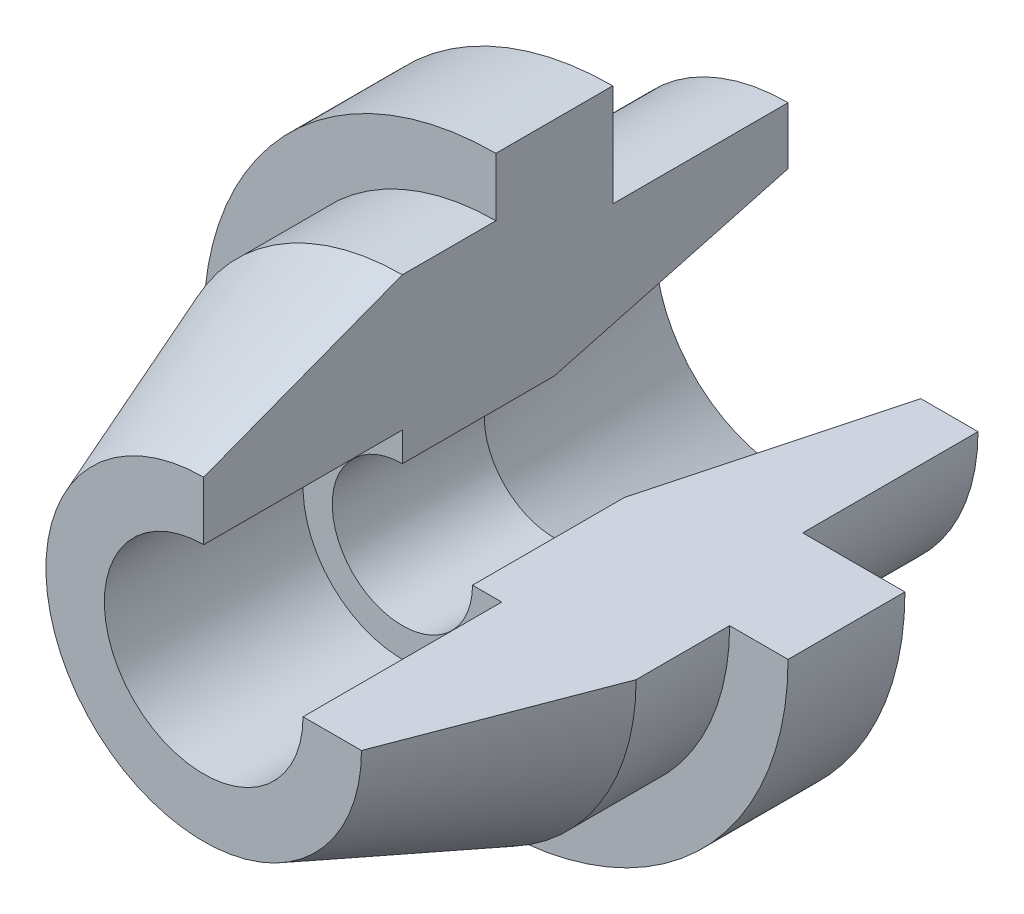
ISO-10303-21;
HEADER;
FILE_DESCRIPTION(('STEP AP214'),'2;1');
FILE_NAME('part.step','',(''),(''),'','','');
FILE_SCHEMA(('AUTOMOTIVE_DESIGN { 1 0 10303 214 1 1 1 1 }'));
ENDSEC;
DATA;
#1=APPLICATION_CONTEXT('core data for automotive mechanical design processes');
#2=APPLICATION_PROTOCOL_DEFINITION('international standard','automotive_design',2000,#1);
#3=PRODUCT_CONTEXT('',#1,'mechanical');
#4=PRODUCT('Part','Part','',(#3));
#5=PRODUCT_RELATED_PRODUCT_CATEGORY('part','',(#4));
#6=PRODUCT_DEFINITION_FORMATION('','',#4);
#7=PRODUCT_DEFINITION_CONTEXT('part definition',#1,'design');
#8=PRODUCT_DEFINITION('design','',#6,#7);
#9=PRODUCT_DEFINITION_SHAPE('','',#8);
#10=(LENGTH_UNIT() NAMED_UNIT(*) SI_UNIT(.MILLI.,.METRE.));
#11=(NAMED_UNIT(*) PLANE_ANGLE_UNIT() SI_UNIT($,.RADIAN.));
#12=(NAMED_UNIT(*) SI_UNIT($,.STERADIAN.) SOLID_ANGLE_UNIT());
#13=UNCERTAINTY_MEASURE_WITH_UNIT(LENGTH_MEASURE(1.E-05),#10,'distance_accuracy_value','');
#14=(GEOMETRIC_REPRESENTATION_CONTEXT(3) GLOBAL_UNCERTAINTY_ASSIGNED_CONTEXT((#13)) GLOBAL_UNIT_ASSIGNED_CONTEXT((#10,
#11,#12)) REPRESENTATION_CONTEXT('',''));
#15=CARTESIAN_POINT('',(0.,0.,0.));
#16=DIRECTION('',(0.,0.,1.));
#17=DIRECTION('',(1.,0.,0.));
#18=AXIS2_PLACEMENT_3D('',#15,#16,#17);
#19=CARTESIAN_POINT('',(0.,0.,0.));
#20=DIRECTION('',(0.,1.,0.));
#21=DIRECTION('',(0.,0.,1.));
#22=AXIS2_PLACEMENT_3D('',#19,#20,#21);
#23=PLANE('',#22);
#24=DIRECTION('',(1.,0.,0.));
#25=VECTOR('',#24,1.);
#26=CARTESIAN_POINT('',(0.,0.,-34.));
#27=LINE('',#26,#25);
#28=CARTESIAN_POINT('',(11.9999999999999,1.25693328198352E-13,-34.));
#29=VERTEX_POINT('',#28);
#30=CARTESIAN_POINT('',(16.9999999999999,1.78065548280999E-13,-34.0000000000001));
#31=VERTEX_POINT('',#30);
#32=EDGE_CURVE('E150',#29,#31,#27,.T.);
#33=ORIENTED_EDGE('',*,*,#32,.T.);
#34=DIRECTION('',(0.,0.,1.));
#35=VECTOR('',#34,1.);
#36=CARTESIAN_POINT('',(16.9999999999999,1.78065548280999E-13,0.));
#37=LINE('',#36,#35);
#38=CARTESIAN_POINT('',(17.,1.78065548281E-13,0.));
#39=VERTEX_POINT('',#38);
#40=EDGE_CURVE('E135',#31,#39,#37,.T.);
#41=ORIENTED_EDGE('',*,*,#40,.T.);
#42=DIRECTION('',(-1.,0.,0.));
#43=VECTOR('',#42,1.);
#44=CARTESIAN_POINT('',(0.,0.,0.));
#45=LINE('',#44,#43);
#46=CARTESIAN_POINT('',(27.,2.82809988446294E-13,0.));
#47=VERTEX_POINT('',#46);
#48=EDGE_CURVE('E225',#47,#39,#45,.T.);
#49=ORIENTED_EDGE('',*,*,#48,.F.);
#50=DIRECTION('',(-0.357137466266591,0.,0.934051834851085));
#51=VECTOR('',#50,1.);
#52=CARTESIAN_POINT('',(27.,2.82809988446294E-13,0.));
#53=LINE('',#52,#51);
#54=CARTESIAN_POINT('',(40.,4.18977760661176E-13,-34.));
#55=VERTEX_POINT('',#54);
#56=EDGE_CURVE('E222',#55,#47,#53,.T.);
#57=ORIENTED_EDGE('',*,*,#56,.F.);
#58=DIRECTION('',(0.,0.,1.));
#59=VECTOR('',#58,1.);
#60=CARTESIAN_POINT('',(40.,4.18977760661176E-13,-34.));
#61=LINE('',#60,#59);
#62=CARTESIAN_POINT('',(40.,4.18977760661176E-13,-50.));
#63=VERTEX_POINT('',#62);
#64=EDGE_CURVE('E218',#63,#55,#61,.T.);
#65=ORIENTED_EDGE('',*,*,#64,.F.);
#66=DIRECTION('',(-1.,0.,0.));
#67=VECTOR('',#66,1.);
#68=CARTESIAN_POINT('',(40.,4.18977760661176E-13,-50.));
#69=LINE('',#68,#67);
#70=CARTESIAN_POINT('',(50.,5.2372220082647E-13,-50.));
#71=VERTEX_POINT('',#70);
#72=EDGE_CURVE('E214',#71,#63,#69,.T.);
#73=ORIENTED_EDGE('',*,*,#72,.F.);
#74=DIRECTION('',(0.,0.,1.));
#75=VECTOR('',#74,1.);
#76=CARTESIAN_POINT('',(50.,5.2372220082647E-13,-50.));
#77=LINE('',#76,#75);
#78=CARTESIAN_POINT('',(50.,5.2372220082647E-13,-70.));
#79=VERTEX_POINT('',#78);
#80=EDGE_CURVE('E210',#79,#71,#77,.T.);
#81=ORIENTED_EDGE('',*,*,#80,.F.);
#82=DIRECTION('',(1.,0.,0.));
#83=VECTOR('',#82,1.);
#84=CARTESIAN_POINT('',(50.,5.2372220082647E-13,-70.));
#85=LINE('',#84,#83);
#86=CARTESIAN_POINT('',(32.5,3.40419430537206E-13,-70.));
#87=VERTEX_POINT('',#86);
#88=EDGE_CURVE('E206',#87,#79,#85,.T.);
#89=ORIENTED_EDGE('',*,*,#88,.F.);
#90=DIRECTION('',(0.,0.,1.));
#91=VECTOR('',#90,1.);
#92=CARTESIAN_POINT('',(32.5,3.40419430537206E-13,-70.));
#93=LINE('',#92,#91);
#94=CARTESIAN_POINT('',(32.5,3.40419430537206E-13,-100.));
#95=VERTEX_POINT('',#94);
#96=EDGE_CURVE('E202',#95,#87,#93,.T.);
#97=ORIENTED_EDGE('',*,*,#96,.F.);
#98=DIRECTION('',(1.,0.,0.));
#99=VECTOR('',#98,1.);
#100=CARTESIAN_POINT('',(32.5,3.40419430537206E-13,-100.));
#101=LINE('',#100,#99);
#102=CARTESIAN_POINT('',(22.7179676972443,2.37958080814109E-13,-100.));
#103=VERTEX_POINT('',#102);
#104=EDGE_CURVE('E199',#103,#95,#101,.T.);
#105=ORIENTED_EDGE('',*,*,#104,.F.);
#106=DIRECTION('',(0.258819045102511,0.,-0.965925826289071));
#107=VECTOR('',#106,1.);
#108=CARTESIAN_POINT('',(0.,0.,-15.2153903091725));
#109=LINE('',#108,#107);
#110=CARTESIAN_POINT('',(11.9999999999998,2.85690460550838E-13,-60.));
#111=VERTEX_POINT('',#110);
#112=EDGE_CURVE('E147',#103,#111,#109,.F.);
#113=ORIENTED_EDGE('',*,*,#112,.T.);
#114=DIRECTION('',(0.,0.,1.));
#115=VECTOR('',#114,1.);
#116=CARTESIAN_POINT('',(11.9999999999998,1.25693328198351E-13,0.));
#117=LINE('',#116,#115);
#118=EDGE_CURVE('E157',#111,#29,#117,.T.);
#119=ORIENTED_EDGE('',*,*,#118,.T.);
#120=EDGE_LOOP('',(#33,#41,#49,#57,#65,#73,#81,#89,#97,#105,#113,#119));
#121=FACE_BOUND('',#120,.T.);
#122=ADVANCED_FACE('F45',(#121),#23,.T.);
#123=CARTESIAN_POINT('',(0.,0.,0.));
#124=DIRECTION('',(-1.,0.,0.));
#125=DIRECTION('',(0.,0.,1.));
#126=AXIS2_PLACEMENT_3D('',#123,#124,#125);
#127=PLANE('',#126);
#128=DIRECTION('',(0.,0.,1.));
#129=VECTOR('',#128,1.);
#130=CARTESIAN_POINT('',(0.,16.9999999999999,0.));
#131=LINE('',#130,#129);
#132=CARTESIAN_POINT('',(0.,17.,-34.));
#133=VERTEX_POINT('',#132);
#134=CARTESIAN_POINT('',(0.,17.,0.));
#135=VERTEX_POINT('',#134);
#136=EDGE_CURVE('E11',#133,#135,#131,.T.);
#137=ORIENTED_EDGE('',*,*,#136,.F.);
#138=DIRECTION('',(0.,1.,0.));
#139=VECTOR('',#138,1.);
#140=CARTESIAN_POINT('',(0.,1.1574260638265E-13,-34.));
#141=LINE('',#140,#139);
#142=CARTESIAN_POINT('',(0.,12.,-34.));
#143=VERTEX_POINT('',#142);
#144=EDGE_CURVE('E152',#143,#133,#141,.T.);
#145=ORIENTED_EDGE('',*,*,#144,.F.);
#146=DIRECTION('',(0.,0.,1.));
#147=VECTOR('',#146,1.);
#148=CARTESIAN_POINT('',(0.,11.9999999999998,0.));
#149=LINE('',#148,#147);
#150=CARTESIAN_POINT('',(0.,12.,-60.));
#151=VERTEX_POINT('',#150);
#152=EDGE_CURVE('E251',#151,#143,#149,.T.);
#153=ORIENTED_EDGE('',*,*,#152,.F.);
#154=DIRECTION('',(0.,0.258819045102514,-0.96592582628907));
#155=VECTOR('',#154,1.);
#156=CARTESIAN_POINT('',(0.,0.,-15.2153903091725));
#157=LINE('',#156,#155);
#158=CARTESIAN_POINT('',(0.,22.7179676972446,-100.));
#159=VERTEX_POINT('',#158);
#160=EDGE_CURVE('E54',#159,#151,#157,.F.);
#161=ORIENTED_EDGE('',*,*,#160,.F.);
#162=DIRECTION('',(0.,1.,0.));
#163=VECTOR('',#162,1.);
#164=CARTESIAN_POINT('',(0.,32.5,-100.));
#165=LINE('',#164,#163);
#166=CARTESIAN_POINT('',(0.,32.5,-100.));
#167=VERTEX_POINT('',#166);
#168=EDGE_CURVE('E146',#159,#167,#165,.T.);
#169=ORIENTED_EDGE('',*,*,#168,.T.);
#170=DIRECTION('',(0.,0.,1.));
#171=VECTOR('',#170,1.);
#172=CARTESIAN_POINT('',(0.,32.5,-70.));
#173=LINE('',#172,#171);
#174=CARTESIAN_POINT('',(0.,32.5,-70.));
#175=VERTEX_POINT('',#174);
#176=EDGE_CURVE('E171',#167,#175,#173,.T.);
#177=ORIENTED_EDGE('',*,*,#176,.T.);
#178=DIRECTION('',(0.,1.,0.));
#179=VECTOR('',#178,1.);
#180=CARTESIAN_POINT('',(0.,50.,-70.));
#181=LINE('',#180,#179);
#182=CARTESIAN_POINT('',(0.,50.,-70.));
#183=VERTEX_POINT('',#182);
#184=EDGE_CURVE('E175',#175,#183,#181,.T.);
#185=ORIENTED_EDGE('',*,*,#184,.T.);
#186=DIRECTION('',(0.,0.,1.));
#187=VECTOR('',#186,1.);
#188=CARTESIAN_POINT('',(0.,50.,-50.));
#189=LINE('',#188,#187);
#190=CARTESIAN_POINT('',(0.,50.,-50.));
#191=VERTEX_POINT('',#190);
#192=EDGE_CURVE('E179',#183,#191,#189,.T.);
#193=ORIENTED_EDGE('',*,*,#192,.T.);
#194=DIRECTION('',(0.,-1.,0.));
#195=VECTOR('',#194,1.);
#196=CARTESIAN_POINT('',(0.,40.,-50.));
#197=LINE('',#196,#195);
#198=CARTESIAN_POINT('',(0.,40.,-50.));
#199=VERTEX_POINT('',#198);
#200=EDGE_CURVE('E183',#191,#199,#197,.T.);
#201=ORIENTED_EDGE('',*,*,#200,.T.);
#202=DIRECTION('',(0.,0.,1.));
#203=VECTOR('',#202,1.);
#204=CARTESIAN_POINT('',(0.,40.,-34.));
#205=LINE('',#204,#203);
#206=CARTESIAN_POINT('',(0.,40.,-34.));
#207=VERTEX_POINT('',#206);
#208=EDGE_CURVE('E187',#199,#207,#205,.T.);
#209=ORIENTED_EDGE('',*,*,#208,.T.);
#210=DIRECTION('',(0.,-0.357137466266591,0.934051834851085));
#211=VECTOR('',#210,1.);
#212=CARTESIAN_POINT('',(0.,27.,0.));
#213=LINE('',#212,#211);
#214=CARTESIAN_POINT('',(0.,27.,0.));
#215=VERTEX_POINT('',#214);
#216=EDGE_CURVE('E191',#207,#215,#213,.T.);
#217=ORIENTED_EDGE('',*,*,#216,.T.);
#218=DIRECTION('',(0.,-1.,0.));
#219=VECTOR('',#218,1.);
#220=CARTESIAN_POINT('',(0.,0.,0.));
#221=LINE('',#220,#219);
#222=EDGE_CURVE('E195',#215,#135,#221,.T.);
#223=ORIENTED_EDGE('',*,*,#222,.T.);
#224=EDGE_LOOP('',(#137,#145,#153,#161,#169,#177,#185,#193,#201,#209,#217,#223));
#225=FACE_BOUND('',#224,.T.);
#226=ADVANCED_FACE('F268',(#225),#127,.F.);
#227=CARTESIAN_POINT('',(0.,0.,0.));
#228=DIRECTION('',(0.,0.,1.));
#229=DIRECTION('',(1.,0.,0.));
#230=AXIS2_PLACEMENT_3D('',#227,#228,#229);
#231=PLANE('',#230);
#232=ORIENTED_EDGE('',*,*,#48,.T.);
#233=CARTESIAN_POINT('',(0.,0.,0.));
#234=DIRECTION('',(0.,0.,1.));
#235=DIRECTION('',(0.,-1.,0.));
#236=AXIS2_PLACEMENT_3D('',#233,#234,#235);
#237=CIRCLE('',#236,17.);
#238=EDGE_CURVE('E141',#135,#39,#237,.T.);
#239=ORIENTED_EDGE('',*,*,#238,.F.);
#240=ORIENTED_EDGE('',*,*,#222,.F.);
#241=CARTESIAN_POINT('',(0.,0.,0.));
#242=DIRECTION('',(0.,0.,-1.));
#243=DIRECTION('',(-1.,0.,0.));
#244=AXIS2_PLACEMENT_3D('',#241,#242,#243);
#245=CIRCLE('',#244,27.);
#246=EDGE_CURVE('E69',#47,#215,#245,.T.);
#247=ORIENTED_EDGE('',*,*,#246,.F.);
#248=EDGE_LOOP('',(#232,#239,#240,#247));
#249=FACE_BOUND('',#248,.T.);
#250=ADVANCED_FACE('F47',(#249),#231,.T.);
#251=CARTESIAN_POINT('',(0.,0.,-34.));
#252=DIRECTION('',(0.,0.,-1.));
#253=DIRECTION('',(-1.,0.,0.));
#254=AXIS2_PLACEMENT_3D('',#251,#252,#253);
#255=CONICAL_SURFACE('',#254,40.,0.365201449788173);
#256=CARTESIAN_POINT('',(0.,0.,-34.));
#257=DIRECTION('',(0.,0.,-1.));
#258=DIRECTION('',(-1.,0.,0.));
#259=AXIS2_PLACEMENT_3D('',#256,#257,#258);
#260=CIRCLE('',#259,40.);
#261=EDGE_CURVE('E244',#55,#207,#260,.T.);
#262=ORIENTED_EDGE('',*,*,#261,.F.);
#263=ORIENTED_EDGE('',*,*,#56,.T.);
#264=ORIENTED_EDGE('',*,*,#246,.T.);
#265=ORIENTED_EDGE('',*,*,#216,.F.);
#266=EDGE_LOOP('',(#262,#263,#264,#265));
#267=FACE_BOUND('',#266,.T.);
#268=ADVANCED_FACE('F273',(#267),#255,.T.);
#269=CARTESIAN_POINT('',(0.,0.,-100.));
#270=DIRECTION('',(0.,0.,-1.));
#271=DIRECTION('',(-1.,0.,0.));
#272=AXIS2_PLACEMENT_3D('',#269,#270,#271);
#273=CYLINDRICAL_SURFACE('',#272,40.);
#274=CARTESIAN_POINT('',(0.,0.,-50.));
#275=DIRECTION('',(0.,0.,-1.));
#276=DIRECTION('',(-1.,0.,0.));
#277=AXIS2_PLACEMENT_3D('',#274,#275,#276);
#278=CIRCLE('',#277,40.);
#279=EDGE_CURVE('E241',#63,#199,#278,.T.);
#280=ORIENTED_EDGE('',*,*,#279,.F.);
#281=ORIENTED_EDGE('',*,*,#64,.T.);
#282=ORIENTED_EDGE('',*,*,#261,.T.);
#283=ORIENTED_EDGE('',*,*,#208,.F.);
#284=EDGE_LOOP('',(#280,#281,#282,#283));
#285=FACE_BOUND('',#284,.T.);
#286=ADVANCED_FACE('F277',(#285),#273,.T.);
#287=CARTESIAN_POINT('',(40.,4.18977760661176E-13,-50.));
#288=DIRECTION('',(0.,0.,1.));
#289=DIRECTION('',(1.,0.,0.));
#290=AXIS2_PLACEMENT_3D('',#287,#288,#289);
#291=PLANE('',#290);
#292=CARTESIAN_POINT('',(0.,0.,-50.));
#293=DIRECTION('',(0.,0.,-1.));
#294=DIRECTION('',(-1.,0.,0.));
#295=AXIS2_PLACEMENT_3D('',#292,#293,#294);
#296=CIRCLE('',#295,50.);
#297=EDGE_CURVE('E238',#71,#191,#296,.T.);
#298=ORIENTED_EDGE('',*,*,#297,.F.);
#299=ORIENTED_EDGE('',*,*,#72,.T.);
#300=ORIENTED_EDGE('',*,*,#279,.T.);
#301=ORIENTED_EDGE('',*,*,#200,.F.);
#302=EDGE_LOOP('',(#298,#299,#300,#301));
#303=FACE_BOUND('',#302,.T.);
#304=ADVANCED_FACE('F280',(#303),#291,.T.);
#305=CARTESIAN_POINT('',(0.,0.,-100.));
#306=DIRECTION('',(0.,0.,-1.));
#307=DIRECTION('',(-1.,0.,0.));
#308=AXIS2_PLACEMENT_3D('',#305,#306,#307);
#309=CYLINDRICAL_SURFACE('',#308,50.);
#310=CARTESIAN_POINT('',(0.,0.,-70.));
#311=DIRECTION('',(0.,0.,-1.));
#312=DIRECTION('',(-1.,0.,0.));
#313=AXIS2_PLACEMENT_3D('',#310,#311,#312);
#314=CIRCLE('',#313,50.);
#315=EDGE_CURVE('E235',#79,#183,#314,.T.);
#316=ORIENTED_EDGE('',*,*,#315,.F.);
#317=ORIENTED_EDGE('',*,*,#80,.T.);
#318=ORIENTED_EDGE('',*,*,#297,.T.);
#319=ORIENTED_EDGE('',*,*,#192,.F.);
#320=EDGE_LOOP('',(#316,#317,#318,#319));
#321=FACE_BOUND('',#320,.T.);
#322=ADVANCED_FACE('F285',(#321),#309,.T.);
#323=CARTESIAN_POINT('',(50.,5.2372220082647E-13,-70.));
#324=DIRECTION('',(0.,0.,-1.));
#325=DIRECTION('',(-1.,0.,0.));
#326=AXIS2_PLACEMENT_3D('',#323,#324,#325);
#327=PLANE('',#326);
#328=CARTESIAN_POINT('',(0.,0.,-70.));
#329=DIRECTION('',(0.,0.,-1.));
#330=DIRECTION('',(-1.,0.,0.));
#331=AXIS2_PLACEMENT_3D('',#328,#329,#330);
#332=CIRCLE('',#331,32.5);
#333=EDGE_CURVE('E232',#87,#175,#332,.T.);
#334=ORIENTED_EDGE('',*,*,#333,.F.);
#335=ORIENTED_EDGE('',*,*,#88,.T.);
#336=ORIENTED_EDGE('',*,*,#315,.T.);
#337=ORIENTED_EDGE('',*,*,#184,.F.);
#338=EDGE_LOOP('',(#334,#335,#336,#337));
#339=FACE_BOUND('',#338,.T.);
#340=ADVANCED_FACE('F289',(#339),#327,.T.);
#341=CARTESIAN_POINT('',(0.,0.,-100.));
#342=DIRECTION('',(0.,0.,-1.));
#343=DIRECTION('',(-1.,0.,0.));
#344=AXIS2_PLACEMENT_3D('',#341,#342,#343);
#345=CYLINDRICAL_SURFACE('',#344,32.5);
#346=CARTESIAN_POINT('',(0.,0.,-100.));
#347=DIRECTION('',(0.,0.,-1.));
#348=DIRECTION('',(-1.,0.,0.));
#349=AXIS2_PLACEMENT_3D('',#346,#347,#348);
#350=CIRCLE('',#349,32.5);
#351=EDGE_CURVE('E228',#95,#167,#350,.T.);
#352=ORIENTED_EDGE('',*,*,#351,.F.);
#353=ORIENTED_EDGE('',*,*,#96,.T.);
#354=ORIENTED_EDGE('',*,*,#333,.T.);
#355=ORIENTED_EDGE('',*,*,#176,.F.);
#356=EDGE_LOOP('',(#352,#353,#354,#355));
#357=FACE_BOUND('',#356,.T.);
#358=ADVANCED_FACE('F293',(#357),#345,.T.);
#359=CARTESIAN_POINT('',(32.5,3.40419430537206E-13,-100.));
#360=DIRECTION('',(0.,0.,-1.));
#361=DIRECTION('',(-1.,0.,0.));
#362=AXIS2_PLACEMENT_3D('',#359,#360,#361);
#363=PLANE('',#362);
#364=ORIENTED_EDGE('',*,*,#168,.F.);
#365=CARTESIAN_POINT('',(0.,3.40419430537206E-13,-100.));
#366=DIRECTION('',(0.,0.,1.));
#367=DIRECTION('',(0.,-1.,0.));
#368=AXIS2_PLACEMENT_3D('',#365,#366,#367);
#369=CIRCLE('',#368,22.7179676972443);
#370=EDGE_CURVE('E163',#159,#103,#369,.T.);
#371=ORIENTED_EDGE('',*,*,#370,.T.);
#372=ORIENTED_EDGE('',*,*,#104,.T.);
#373=ORIENTED_EDGE('',*,*,#351,.T.);
#374=EDGE_LOOP('',(#364,#371,#372,#373));
#375=FACE_BOUND('',#374,.T.);
#376=ADVANCED_FACE('F296',(#375),#363,.T.);
#377=CARTESIAN_POINT('',(0.,0.,0.));
#378=DIRECTION('',(0.,0.,1.));
#379=DIRECTION('',(0.,-1.,0.));
#380=AXIS2_PLACEMENT_3D('',#377,#378,#379);
#381=CYLINDRICAL_SURFACE('',#380,16.9999999999999);
#382=CARTESIAN_POINT('',(0.,1.1574260638265E-13,-34.0000000000001));
#383=DIRECTION('',(0.,0.,1.));
#384=DIRECTION('',(0.,-1.,0.));
#385=AXIS2_PLACEMENT_3D('',#382,#383,#384);
#386=CIRCLE('',#385,16.9999999999999);
#387=EDGE_CURVE('E138',#133,#31,#386,.T.);
#388=ORIENTED_EDGE('',*,*,#387,.F.);
#389=ORIENTED_EDGE('',*,*,#136,.T.);
#390=ORIENTED_EDGE('',*,*,#238,.T.);
#391=ORIENTED_EDGE('',*,*,#40,.F.);
#392=EDGE_LOOP('',(#388,#389,#390,#391));
#393=FACE_BOUND('',#392,.T.);
#394=ADVANCED_FACE('F137',(#393),#381,.F.);
#395=CARTESIAN_POINT('',(0.,3.40419430537206E-13,-100.));
#396=DIRECTION('',(0.,0.,-1.));
#397=DIRECTION('',(0.,1.,0.));
#398=AXIS2_PLACEMENT_3D('',#395,#396,#397);
#399=CONICAL_SURFACE('',#398,22.7179676972443,0.26179938779914);
#400=ORIENTED_EDGE('',*,*,#370,.F.);
#401=ORIENTED_EDGE('',*,*,#160,.T.);
#402=CARTESIAN_POINT('',(0.,2.04251658322323E-13,-60.));
#403=DIRECTION('',(0.,0.,1.));
#404=DIRECTION('',(0.,-1.,0.));
#405=AXIS2_PLACEMENT_3D('',#402,#403,#404);
#406=CIRCLE('',#405,11.9999999999998);
#407=EDGE_CURVE('E259',#151,#111,#406,.T.);
#408=ORIENTED_EDGE('',*,*,#407,.T.);
#409=ORIENTED_EDGE('',*,*,#112,.F.);
#410=EDGE_LOOP('',(#400,#401,#408,#409));
#411=FACE_BOUND('',#410,.T.);
#412=ADVANCED_FACE('F258',(#411),#399,.F.);
#413=CARTESIAN_POINT('',(0.,0.,0.));
#414=DIRECTION('',(0.,0.,1.));
#415=DIRECTION('',(0.,-1.,0.));
#416=AXIS2_PLACEMENT_3D('',#413,#414,#415);
#417=CYLINDRICAL_SURFACE('',#416,11.9999999999998);
#418=ORIENTED_EDGE('',*,*,#407,.F.);
#419=ORIENTED_EDGE('',*,*,#152,.T.);
#420=CARTESIAN_POINT('',(0.,1.1574260638265E-13,-34.));
#421=DIRECTION('',(0.,0.,1.));
#422=DIRECTION('',(0.,-1.,0.));
#423=AXIS2_PLACEMENT_3D('',#420,#421,#422);
#424=CIRCLE('',#423,11.9999999999999);
#425=EDGE_CURVE('E61',#143,#29,#424,.T.);
#426=ORIENTED_EDGE('',*,*,#425,.T.);
#427=ORIENTED_EDGE('',*,*,#118,.F.);
#428=EDGE_LOOP('',(#418,#419,#426,#427));
#429=FACE_BOUND('',#428,.T.);
#430=ADVANCED_FACE('F265',(#429),#417,.F.);
#431=CARTESIAN_POINT('',(0.,12.,-34.));
#432=DIRECTION('',(0.,0.,1.));
#433=DIRECTION('',(0.,-1.,0.));
#434=AXIS2_PLACEMENT_3D('',#431,#432,#433);
#435=PLANE('',#434);
#436=ORIENTED_EDGE('',*,*,#425,.F.);
#437=ORIENTED_EDGE('',*,*,#144,.T.);
#438=ORIENTED_EDGE('',*,*,#387,.T.);
#439=ORIENTED_EDGE('',*,*,#32,.F.);
#440=EDGE_LOOP('',(#436,#437,#438,#439));
#441=FACE_BOUND('',#440,.T.);
#442=ADVANCED_FACE('F149',(#441),#435,.T.);
#443=CLOSED_SHELL('',(#122,#226,#250,#268,#286,#304,#322,#340,#358,#376,#394,#412,#430,#442));
#444=MANIFOLD_SOLID_BREP('B2',#443);
#445=ADVANCED_BREP_SHAPE_REPRESENTATION('',(#18,#444),#14);
#446=SHAPE_DEFINITION_REPRESENTATION(#9,#445);
ENDSEC;
END-ISO-10303-21;
